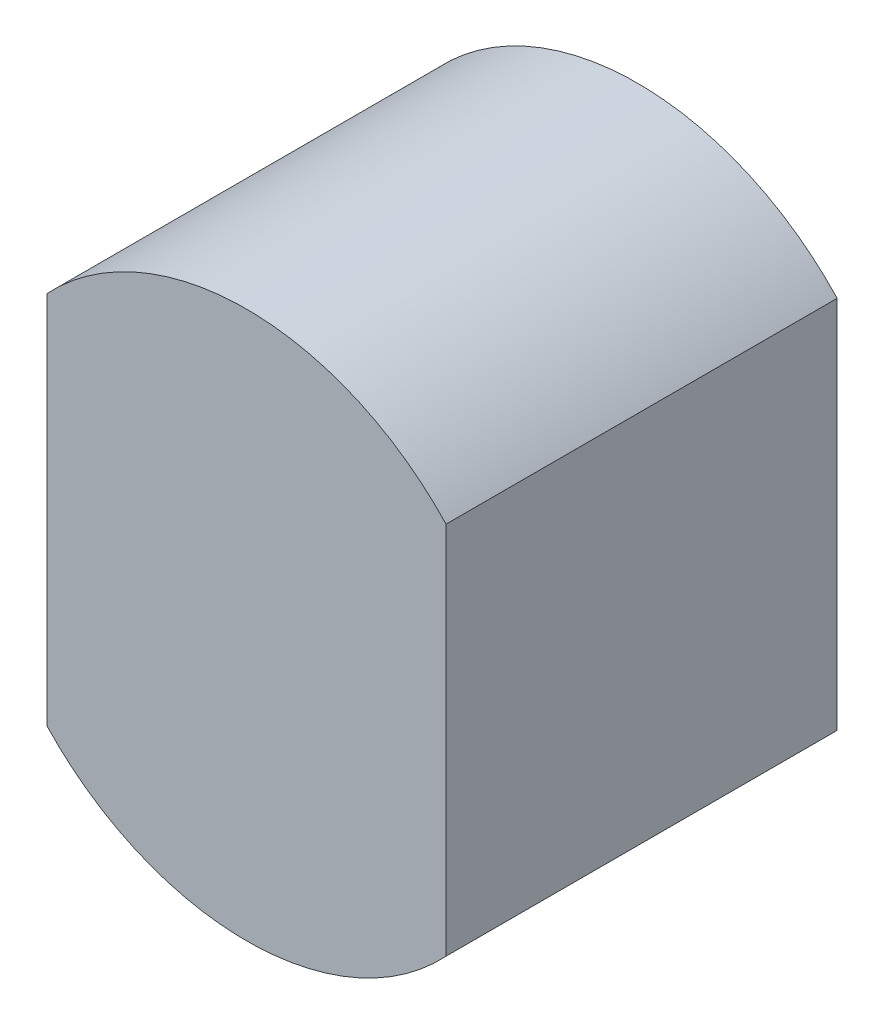
ISO-10303-21;
HEADER;
FILE_DESCRIPTION(('STEP AP214'),'2;1');
FILE_NAME('part.step','',(''),(''),'','','');
FILE_SCHEMA(('AUTOMOTIVE_DESIGN { 1 0 10303 214 1 1 1 1 }'));
ENDSEC;
DATA;
#1=APPLICATION_CONTEXT('core data for automotive mechanical design processes');
#2=APPLICATION_PROTOCOL_DEFINITION('international standard','automotive_design',2000,#1);
#3=PRODUCT_CONTEXT('',#1,'mechanical');
#4=PRODUCT('Part','Part','',(#3));
#5=PRODUCT_RELATED_PRODUCT_CATEGORY('part','',(#4));
#6=PRODUCT_DEFINITION_FORMATION('','',#4);
#7=PRODUCT_DEFINITION_CONTEXT('part definition',#1,'design');
#8=PRODUCT_DEFINITION('design','',#6,#7);
#9=PRODUCT_DEFINITION_SHAPE('','',#8);
#10=(LENGTH_UNIT() NAMED_UNIT(*) SI_UNIT(.MILLI.,.METRE.));
#11=(NAMED_UNIT(*) PLANE_ANGLE_UNIT() SI_UNIT($,.RADIAN.));
#12=(NAMED_UNIT(*) SI_UNIT($,.STERADIAN.) SOLID_ANGLE_UNIT());
#13=UNCERTAINTY_MEASURE_WITH_UNIT(LENGTH_MEASURE(1.E-05),#10,'distance_accuracy_value','');
#14=(GEOMETRIC_REPRESENTATION_CONTEXT(3) GLOBAL_UNCERTAINTY_ASSIGNED_CONTEXT((#13)) GLOBAL_UNIT_ASSIGNED_CONTEXT((#10,
#11,#12)) REPRESENTATION_CONTEXT('',''));
#15=CARTESIAN_POINT('',(0.,0.,0.));
#16=DIRECTION('',(0.,0.,1.));
#17=DIRECTION('',(1.,0.,0.));
#18=AXIS2_PLACEMENT_3D('',#15,#16,#17);
#19=CARTESIAN_POINT('',(0.,0.,49.022));
#20=DIRECTION('',(0.,0.,-1.));
#21=DIRECTION('',(-1.,0.,0.));
#22=AXIS2_PLACEMENT_3D('',#19,#20,#21);
#23=CYLINDRICAL_SURFACE('',#22,34.29);
#24=CARTESIAN_POINT('',(0.,0.,0.));
#25=DIRECTION('',(0.,0.,1.));
#26=DIRECTION('',(1.,0.,0.));
#27=AXIS2_PLACEMENT_3D('',#24,#25,#26);
#28=CIRCLE('',#27,34.29);
#29=CARTESIAN_POINT('',(-25.019,-23.4489602967808,0.));
#30=VERTEX_POINT('',#29);
#31=CARTESIAN_POINT('',(25.019,-23.4489602967808,0.));
#32=VERTEX_POINT('',#31);
#33=EDGE_CURVE('E98',#30,#32,#28,.T.);
#34=ORIENTED_EDGE('',*,*,#33,.T.);
#35=DIRECTION('',(0.,0.,-1.));
#36=VECTOR('',#35,1.);
#37=CARTESIAN_POINT('',(25.019,-23.4489602967808,49.022));
#38=LINE('',#37,#36);
#39=CARTESIAN_POINT('',(25.019,-23.4489602967808,49.022));
#40=VERTEX_POINT('',#39);
#41=EDGE_CURVE('E11',#40,#32,#38,.T.);
#42=ORIENTED_EDGE('',*,*,#41,.F.);
#43=CARTESIAN_POINT('',(0.,0.,49.022));
#44=DIRECTION('',(0.,0.,1.));
#45=DIRECTION('',(1.,0.,0.));
#46=AXIS2_PLACEMENT_3D('',#43,#44,#45);
#47=CIRCLE('',#46,34.29);
#48=CARTESIAN_POINT('',(-25.019,-23.4489602967808,49.022));
#49=VERTEX_POINT('',#48);
#50=EDGE_CURVE('E86',#49,#40,#47,.T.);
#51=ORIENTED_EDGE('',*,*,#50,.F.);
#52=DIRECTION('',(0.,0.,-1.));
#53=VECTOR('',#52,1.);
#54=CARTESIAN_POINT('',(-25.019,-23.4489602967808,49.022));
#55=LINE('',#54,#53);
#56=EDGE_CURVE('E94',#49,#30,#55,.T.);
#57=ORIENTED_EDGE('',*,*,#56,.T.);
#58=EDGE_LOOP('',(#34,#42,#51,#57));
#59=FACE_BOUND('',#58,.T.);
#60=ADVANCED_FACE('F35',(#59),#23,.T.);
#61=CARTESIAN_POINT('',(25.019,23.4489602967808,49.022));
#62=DIRECTION('',(-1.,0.,0.));
#63=DIRECTION('',(0.,-1.,0.));
#64=AXIS2_PLACEMENT_3D('',#61,#62,#63);
#65=PLANE('',#64);
#66=DIRECTION('',(0.,1.,0.));
#67=VECTOR('',#66,1.);
#68=CARTESIAN_POINT('',(25.019,23.4489602967808,0.));
#69=LINE('',#68,#67);
#70=CARTESIAN_POINT('',(25.019,23.4489602967808,0.));
#71=VERTEX_POINT('',#70);
#72=EDGE_CURVE('E90',#32,#71,#69,.T.);
#73=ORIENTED_EDGE('',*,*,#72,.T.);
#74=DIRECTION('',(0.,0.,-1.));
#75=VECTOR('',#74,1.);
#76=CARTESIAN_POINT('',(25.019,23.4489602967808,49.022));
#77=LINE('',#76,#75);
#78=CARTESIAN_POINT('',(25.019,23.4489602967808,49.022));
#79=VERTEX_POINT('',#78);
#80=EDGE_CURVE('E43',#79,#71,#77,.T.);
#81=ORIENTED_EDGE('',*,*,#80,.F.);
#82=DIRECTION('',(0.,1.,0.));
#83=VECTOR('',#82,1.);
#84=CARTESIAN_POINT('',(25.019,23.4489602967808,49.022));
#85=LINE('',#84,#83);
#86=EDGE_CURVE('E81',#40,#79,#85,.T.);
#87=ORIENTED_EDGE('',*,*,#86,.F.);
#88=ORIENTED_EDGE('',*,*,#41,.T.);
#89=EDGE_LOOP('',(#73,#81,#87,#88));
#90=FACE_BOUND('',#89,.T.);
#91=ADVANCED_FACE('F89',(#90),#65,.F.);
#92=CARTESIAN_POINT('',(0.,0.,49.022));
#93=DIRECTION('',(0.,0.,-1.));
#94=DIRECTION('',(-1.,0.,0.));
#95=AXIS2_PLACEMENT_3D('',#92,#93,#94);
#96=CYLINDRICAL_SURFACE('',#95,34.29);
#97=CARTESIAN_POINT('',(0.,0.,0.));
#98=DIRECTION('',(0.,0.,1.));
#99=DIRECTION('',(1.,0.,0.));
#100=AXIS2_PLACEMENT_3D('',#97,#98,#99);
#101=CIRCLE('',#100,34.29);
#102=CARTESIAN_POINT('',(-25.019,23.4489602967808,0.));
#103=VERTEX_POINT('',#102);
#104=EDGE_CURVE('E68',#71,#103,#101,.T.);
#105=ORIENTED_EDGE('',*,*,#104,.T.);
#106=DIRECTION('',(0.,0.,-1.));
#107=VECTOR('',#106,1.);
#108=CARTESIAN_POINT('',(-25.019,23.4489602967808,49.022));
#109=LINE('',#108,#107);
#110=CARTESIAN_POINT('',(-25.019,23.4489602967808,49.022));
#111=VERTEX_POINT('',#110);
#112=EDGE_CURVE('E91',#111,#103,#109,.T.);
#113=ORIENTED_EDGE('',*,*,#112,.F.);
#114=CARTESIAN_POINT('',(0.,0.,49.022));
#115=DIRECTION('',(0.,0.,1.));
#116=DIRECTION('',(1.,0.,0.));
#117=AXIS2_PLACEMENT_3D('',#114,#115,#116);
#118=CIRCLE('',#117,34.29);
#119=EDGE_CURVE('E84',#79,#111,#118,.T.);
#120=ORIENTED_EDGE('',*,*,#119,.F.);
#121=ORIENTED_EDGE('',*,*,#80,.T.);
#122=EDGE_LOOP('',(#105,#113,#120,#121));
#123=FACE_BOUND('',#122,.T.);
#124=ADVANCED_FACE('F92',(#123),#96,.T.);
#125=CARTESIAN_POINT('',(-25.019,23.4489602967808,49.022));
#126=DIRECTION('',(1.,0.,0.));
#127=DIRECTION('',(0.,1.,0.));
#128=AXIS2_PLACEMENT_3D('',#125,#126,#127);
#129=PLANE('',#128);
#130=DIRECTION('',(0.,-1.,0.));
#131=VECTOR('',#130,1.);
#132=CARTESIAN_POINT('',(-25.019,23.4489602967808,0.));
#133=LINE('',#132,#131);
#134=EDGE_CURVE('E74',#103,#30,#133,.T.);
#135=ORIENTED_EDGE('',*,*,#134,.T.);
#136=ORIENTED_EDGE('',*,*,#56,.F.);
#137=DIRECTION('',(0.,-1.,0.));
#138=VECTOR('',#137,1.);
#139=CARTESIAN_POINT('',(-25.019,23.4489602967808,49.022));
#140=LINE('',#139,#138);
#141=EDGE_CURVE('E51',#111,#49,#140,.T.);
#142=ORIENTED_EDGE('',*,*,#141,.F.);
#143=ORIENTED_EDGE('',*,*,#112,.T.);
#144=EDGE_LOOP('',(#135,#136,#142,#143));
#145=FACE_BOUND('',#144,.T.);
#146=ADVANCED_FACE('F105',(#145),#129,.F.);
#147=CARTESIAN_POINT('',(0.,0.,49.022));
#148=DIRECTION('',(0.,0.,1.));
#149=DIRECTION('',(1.,0.,0.));
#150=AXIS2_PLACEMENT_3D('',#147,#148,#149);
#151=PLANE('',#150);
#152=ORIENTED_EDGE('',*,*,#50,.T.);
#153=ORIENTED_EDGE('',*,*,#86,.T.);
#154=ORIENTED_EDGE('',*,*,#119,.T.);
#155=ORIENTED_EDGE('',*,*,#141,.T.);
#156=EDGE_LOOP('',(#152,#153,#154,#155));
#157=FACE_BOUND('',#156,.T.);
#158=ADVANCED_FACE('F82',(#157),#151,.T.);
#159=CARTESIAN_POINT('',(0.,0.,0.));
#160=DIRECTION('',(0.,0.,1.));
#161=DIRECTION('',(1.,0.,0.));
#162=AXIS2_PLACEMENT_3D('',#159,#160,#161);
#163=PLANE('',#162);
#164=ORIENTED_EDGE('',*,*,#33,.F.);
#165=ORIENTED_EDGE('',*,*,#134,.F.);
#166=ORIENTED_EDGE('',*,*,#104,.F.);
#167=ORIENTED_EDGE('',*,*,#72,.F.);
#168=EDGE_LOOP('',(#164,#165,#166,#167));
#169=FACE_BOUND('',#168,.T.);
#170=ADVANCED_FACE('F108',(#169),#163,.F.);
#171=CLOSED_SHELL('',(#60,#91,#124,#146,#158,#170));
#172=MANIFOLD_SOLID_BREP('B2',#171);
#173=ADVANCED_BREP_SHAPE_REPRESENTATION('',(#18,#172),#14);
#174=SHAPE_DEFINITION_REPRESENTATION(#9,#173);
ENDSEC;
END-ISO-10303-21;
